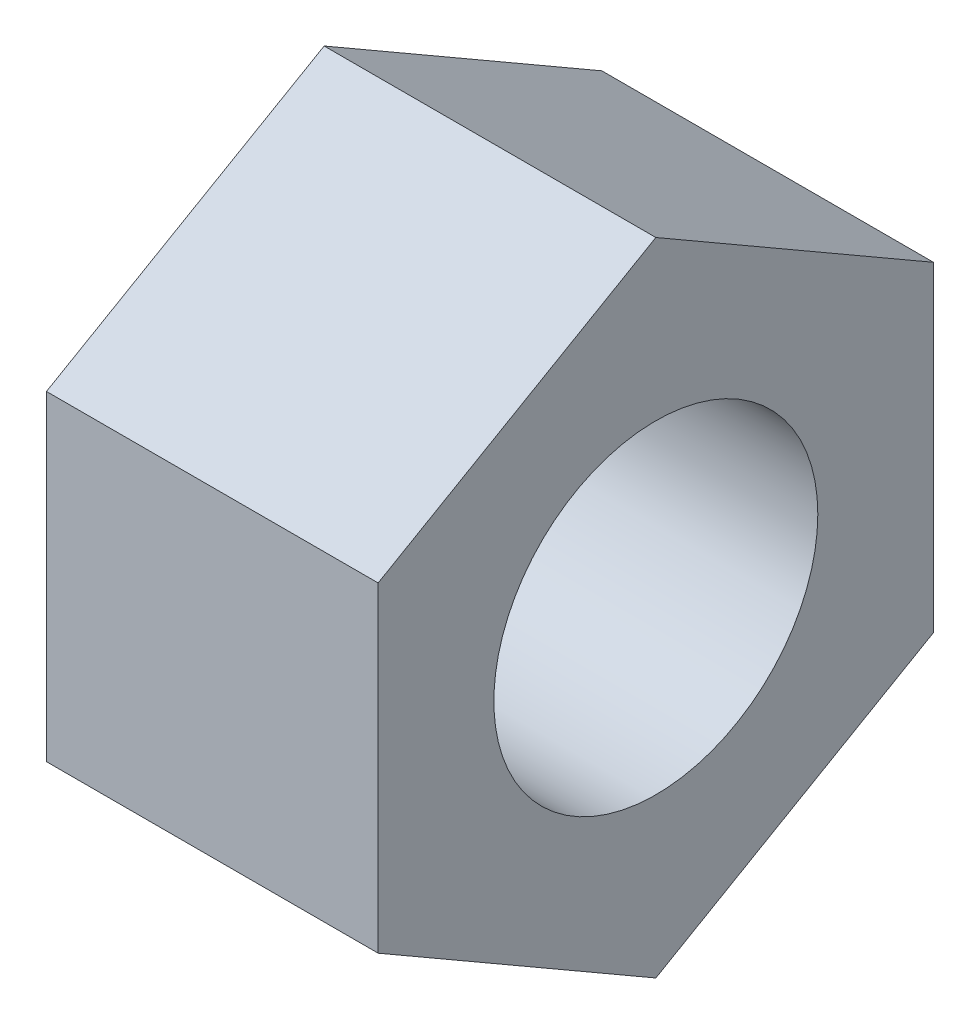
ISO-10303-21;
HEADER;
FILE_DESCRIPTION(('STEP AP214'),'2;1');
FILE_NAME('part.step','',(''),(''),'','','');
FILE_SCHEMA(('AUTOMOTIVE_DESIGN { 1 0 10303 214 1 1 1 1 }'));
ENDSEC;
DATA;
#1=APPLICATION_CONTEXT('core data for automotive mechanical design processes');
#2=APPLICATION_PROTOCOL_DEFINITION('international standard','automotive_design',2000,#1);
#3=PRODUCT_CONTEXT('',#1,'mechanical');
#4=PRODUCT('Part','Part','',(#3));
#5=PRODUCT_RELATED_PRODUCT_CATEGORY('part','',(#4));
#6=PRODUCT_DEFINITION_FORMATION('','',#4);
#7=PRODUCT_DEFINITION_CONTEXT('part definition',#1,'design');
#8=PRODUCT_DEFINITION('design','',#6,#7);
#9=PRODUCT_DEFINITION_SHAPE('','',#8);
#10=(LENGTH_UNIT() NAMED_UNIT(*) SI_UNIT(.MILLI.,.METRE.));
#11=(NAMED_UNIT(*) PLANE_ANGLE_UNIT() SI_UNIT($,.RADIAN.));
#12=(NAMED_UNIT(*) SI_UNIT($,.STERADIAN.) SOLID_ANGLE_UNIT());
#13=UNCERTAINTY_MEASURE_WITH_UNIT(LENGTH_MEASURE(1.E-05),#10,'distance_accuracy_value','');
#14=(GEOMETRIC_REPRESENTATION_CONTEXT(3) GLOBAL_UNCERTAINTY_ASSIGNED_CONTEXT((#13)) GLOBAL_UNIT_ASSIGNED_CONTEXT((#10,
#11,#12)) REPRESENTATION_CONTEXT('',''));
#15=CARTESIAN_POINT('',(0.,0.,0.));
#16=DIRECTION('',(0.,0.,1.));
#17=DIRECTION('',(1.,0.,0.));
#18=AXIS2_PLACEMENT_3D('',#15,#16,#17);
#19=CARTESIAN_POINT('',(21.5,-10.3923048454133,-18.));
#20=DIRECTION('',(1.,0.,0.));
#21=DIRECTION('',(0.,0.,-1.));
#22=AXIS2_PLACEMENT_3D('',#19,#20,#21);
#23=PLANE('',#22);
#24=DIRECTION('',(0.,0.5,-0.866025403784439));
#25=VECTOR('',#24,1.);
#26=CARTESIAN_POINT('',(21.5,-20.7846096908265,0.));
#27=LINE('',#26,#25);
#28=CARTESIAN_POINT('',(21.5,-20.7846096908265,0.));
#29=VERTEX_POINT('',#28);
#30=CARTESIAN_POINT('',(21.5,-10.3923048454133,-18.));
#31=VERTEX_POINT('',#30);
#32=EDGE_CURVE('E132',#29,#31,#27,.T.);
#33=ORIENTED_EDGE('',*,*,#32,.T.);
#34=DIRECTION('',(0.,1.,0.));
#35=VECTOR('',#34,1.);
#36=CARTESIAN_POINT('',(21.5,-10.3923048454133,-18.));
#37=LINE('',#36,#35);
#38=CARTESIAN_POINT('',(21.5,10.3923048454133,-18.));
#39=VERTEX_POINT('',#38);
#40=EDGE_CURVE('E90',#31,#39,#37,.T.);
#41=ORIENTED_EDGE('',*,*,#40,.T.);
#42=DIRECTION('',(0.,0.5,0.866025403784439));
#43=VECTOR('',#42,1.);
#44=CARTESIAN_POINT('',(21.5,10.3923048454133,-18.));
#45=LINE('',#44,#43);
#46=CARTESIAN_POINT('',(21.5,20.7846096908265,0.));
#47=VERTEX_POINT('',#46);
#48=EDGE_CURVE('E103',#39,#47,#45,.T.);
#49=ORIENTED_EDGE('',*,*,#48,.T.);
#50=DIRECTION('',(0.,-0.5,0.866025403784439));
#51=VECTOR('',#50,1.);
#52=CARTESIAN_POINT('',(21.5,20.7846096908265,0.));
#53=LINE('',#52,#51);
#54=CARTESIAN_POINT('',(21.5,10.3923048454133,18.));
#55=VERTEX_POINT('',#54);
#56=EDGE_CURVE('E97',#47,#55,#53,.T.);
#57=ORIENTED_EDGE('',*,*,#56,.T.);
#58=DIRECTION('',(0.,-1.,0.));
#59=VECTOR('',#58,1.);
#60=CARTESIAN_POINT('',(21.5,10.3923048454133,18.));
#61=LINE('',#60,#59);
#62=CARTESIAN_POINT('',(21.5,-10.3923048454133,18.));
#63=VERTEX_POINT('',#62);
#64=EDGE_CURVE('E101',#55,#63,#61,.T.);
#65=ORIENTED_EDGE('',*,*,#64,.T.);
#66=DIRECTION('',(0.,-0.5,-0.866025403784439));
#67=VECTOR('',#66,1.);
#68=CARTESIAN_POINT('',(21.5,-10.3923048454133,18.));
#69=LINE('',#68,#67);
#70=EDGE_CURVE('E53',#63,#29,#69,.T.);
#71=ORIENTED_EDGE('',*,*,#70,.T.);
#72=EDGE_LOOP('',(#33,#41,#49,#57,#65,#71));
#73=FACE_BOUND('',#72,.T.);
#74=CARTESIAN_POINT('',(21.5,0.,0.));
#75=DIRECTION('',(1.,0.,0.));
#76=DIRECTION('',(0.,0.,-1.));
#77=AXIS2_PLACEMENT_3D('',#74,#75,#76);
#78=CIRCLE('',#77,10.5);
#79=CARTESIAN_POINT('',(21.5,0.,-10.5));
#80=VERTEX_POINT('',#79);
#81=EDGE_CURVE('E125',#80,#80,#78,.T.);
#82=ORIENTED_EDGE('',*,*,#81,.F.);
#83=EDGE_LOOP('',(#82));
#84=FACE_BOUND('',#83,.T.);
#85=ADVANCED_FACE('F36',(#73,#84),#23,.T.);
#86=CARTESIAN_POINT('',(0.,-10.3923048454133,-18.));
#87=DIRECTION('',(1.,0.,0.));
#88=DIRECTION('',(0.,0.,-1.));
#89=AXIS2_PLACEMENT_3D('',#86,#87,#88);
#90=PLANE('',#89);
#91=DIRECTION('',(0.,0.5,-0.866025403784439));
#92=VECTOR('',#91,1.);
#93=CARTESIAN_POINT('',(0.,-20.7846096908265,0.));
#94=LINE('',#93,#92);
#95=CARTESIAN_POINT('',(0.,-20.7846096908265,0.));
#96=VERTEX_POINT('',#95);
#97=CARTESIAN_POINT('',(0.,-10.3923048454133,-18.));
#98=VERTEX_POINT('',#97);
#99=EDGE_CURVE('E121',#96,#98,#94,.T.);
#100=ORIENTED_EDGE('',*,*,#99,.F.);
#101=DIRECTION('',(0.,-0.5,-0.866025403784439));
#102=VECTOR('',#101,1.);
#103=CARTESIAN_POINT('',(0.,-10.3923048454133,18.));
#104=LINE('',#103,#102);
#105=CARTESIAN_POINT('',(0.,-10.3923048454133,18.));
#106=VERTEX_POINT('',#105);
#107=EDGE_CURVE('E82',#106,#96,#104,.T.);
#108=ORIENTED_EDGE('',*,*,#107,.F.);
#109=DIRECTION('',(0.,-1.,0.));
#110=VECTOR('',#109,1.);
#111=CARTESIAN_POINT('',(0.,10.3923048454133,18.));
#112=LINE('',#111,#110);
#113=CARTESIAN_POINT('',(0.,10.3923048454133,18.));
#114=VERTEX_POINT('',#113);
#115=EDGE_CURVE('E76',#114,#106,#112,.T.);
#116=ORIENTED_EDGE('',*,*,#115,.F.);
#117=DIRECTION('',(0.,-0.5,0.866025403784439));
#118=VECTOR('',#117,1.);
#119=CARTESIAN_POINT('',(0.,20.7846096908265,0.));
#120=LINE('',#119,#118);
#121=CARTESIAN_POINT('',(0.,20.7846096908265,0.));
#122=VERTEX_POINT('',#121);
#123=EDGE_CURVE('E111',#122,#114,#120,.T.);
#124=ORIENTED_EDGE('',*,*,#123,.F.);
#125=DIRECTION('',(0.,0.5,0.866025403784439));
#126=VECTOR('',#125,1.);
#127=CARTESIAN_POINT('',(0.,10.3923048454133,-18.));
#128=LINE('',#127,#126);
#129=CARTESIAN_POINT('',(0.,10.3923048454133,-18.));
#130=VERTEX_POINT('',#129);
#131=EDGE_CURVE('E127',#130,#122,#128,.T.);
#132=ORIENTED_EDGE('',*,*,#131,.F.);
#133=DIRECTION('',(0.,1.,0.));
#134=VECTOR('',#133,1.);
#135=CARTESIAN_POINT('',(0.,-10.3923048454133,-18.));
#136=LINE('',#135,#134);
#137=EDGE_CURVE('E124',#98,#130,#136,.T.);
#138=ORIENTED_EDGE('',*,*,#137,.F.);
#139=EDGE_LOOP('',(#100,#108,#116,#124,#132,#138));
#140=FACE_BOUND('',#139,.T.);
#141=CARTESIAN_POINT('',(0.,0.,0.));
#142=DIRECTION('',(1.,0.,0.));
#143=DIRECTION('',(0.,0.,-1.));
#144=AXIS2_PLACEMENT_3D('',#141,#142,#143);
#145=CIRCLE('',#144,10.5);
#146=CARTESIAN_POINT('',(0.,0.,-10.5));
#147=VERTEX_POINT('',#146);
#148=EDGE_CURVE('E227',#147,#147,#145,.T.);
#149=ORIENTED_EDGE('',*,*,#148,.T.);
#150=EDGE_LOOP('',(#149));
#151=FACE_BOUND('',#150,.T.);
#152=ADVANCED_FACE('F141',(#140,#151),#90,.F.);
#153=CARTESIAN_POINT('',(21.5,-20.7846096908265,0.));
#154=DIRECTION('',(0.,0.866025403784439,0.5));
#155=DIRECTION('',(0.,-0.5,0.866025403784439));
#156=AXIS2_PLACEMENT_3D('',#153,#154,#155);
#157=PLANE('',#156);
#158=ORIENTED_EDGE('',*,*,#99,.T.);
#159=DIRECTION('',(-1.,0.,0.));
#160=VECTOR('',#159,1.);
#161=CARTESIAN_POINT('',(21.5,-10.3923048454133,-18.));
#162=LINE('',#161,#160);
#163=EDGE_CURVE('E11',#31,#98,#162,.T.);
#164=ORIENTED_EDGE('',*,*,#163,.F.);
#165=ORIENTED_EDGE('',*,*,#32,.F.);
#166=DIRECTION('',(-1.,0.,0.));
#167=VECTOR('',#166,1.);
#168=CARTESIAN_POINT('',(21.5,-20.7846096908265,0.));
#169=LINE('',#168,#167);
#170=EDGE_CURVE('E117',#29,#96,#169,.T.);
#171=ORIENTED_EDGE('',*,*,#170,.T.);
#172=EDGE_LOOP('',(#158,#164,#165,#171));
#173=FACE_BOUND('',#172,.T.);
#174=ADVANCED_FACE('F38',(#173),#157,.F.);
#175=CARTESIAN_POINT('',(21.5,-10.3923048454133,-18.));
#176=DIRECTION('',(0.,0.,1.));
#177=DIRECTION('',(0.,-1.,0.));
#178=AXIS2_PLACEMENT_3D('',#175,#176,#177);
#179=PLANE('',#178);
#180=ORIENTED_EDGE('',*,*,#137,.T.);
#181=DIRECTION('',(-1.,0.,0.));
#182=VECTOR('',#181,1.);
#183=CARTESIAN_POINT('',(21.5,10.3923048454133,-18.));
#184=LINE('',#183,#182);
#185=EDGE_CURVE('E45',#39,#130,#184,.T.);
#186=ORIENTED_EDGE('',*,*,#185,.F.);
#187=ORIENTED_EDGE('',*,*,#40,.F.);
#188=ORIENTED_EDGE('',*,*,#163,.T.);
#189=EDGE_LOOP('',(#180,#186,#187,#188));
#190=FACE_BOUND('',#189,.T.);
#191=ADVANCED_FACE('F166',(#190),#179,.F.);
#192=CARTESIAN_POINT('',(21.5,10.3923048454133,-18.));
#193=DIRECTION('',(0.,-0.866025403784439,0.5));
#194=DIRECTION('',(0.,-0.5,-0.866025403784439));
#195=AXIS2_PLACEMENT_3D('',#192,#193,#194);
#196=PLANE('',#195);
#197=ORIENTED_EDGE('',*,*,#131,.T.);
#198=DIRECTION('',(-1.,0.,0.));
#199=VECTOR('',#198,1.);
#200=CARTESIAN_POINT('',(21.5,20.7846096908265,0.));
#201=LINE('',#200,#199);
#202=EDGE_CURVE('E112',#47,#122,#201,.T.);
#203=ORIENTED_EDGE('',*,*,#202,.F.);
#204=ORIENTED_EDGE('',*,*,#48,.F.);
#205=ORIENTED_EDGE('',*,*,#185,.T.);
#206=EDGE_LOOP('',(#197,#203,#204,#205));
#207=FACE_BOUND('',#206,.T.);
#208=ADVANCED_FACE('F138',(#207),#196,.F.);
#209=CARTESIAN_POINT('',(21.5,20.7846096908265,0.));
#210=DIRECTION('',(0.,-0.866025403784439,-0.5));
#211=DIRECTION('',(0.,0.5,-0.866025403784439));
#212=AXIS2_PLACEMENT_3D('',#209,#210,#211);
#213=PLANE('',#212);
#214=ORIENTED_EDGE('',*,*,#123,.T.);
#215=DIRECTION('',(-1.,0.,0.));
#216=VECTOR('',#215,1.);
#217=CARTESIAN_POINT('',(21.5,10.3923048454133,18.));
#218=LINE('',#217,#216);
#219=EDGE_CURVE('E108',#55,#114,#218,.T.);
#220=ORIENTED_EDGE('',*,*,#219,.F.);
#221=ORIENTED_EDGE('',*,*,#56,.F.);
#222=ORIENTED_EDGE('',*,*,#202,.T.);
#223=EDGE_LOOP('',(#214,#220,#221,#222));
#224=FACE_BOUND('',#223,.T.);
#225=ADVANCED_FACE('F109',(#224),#213,.F.);
#226=CARTESIAN_POINT('',(21.5,10.3923048454133,18.));
#227=DIRECTION('',(0.,0.,-1.));
#228=DIRECTION('',(0.,1.,0.));
#229=AXIS2_PLACEMENT_3D('',#226,#227,#228);
#230=PLANE('',#229);
#231=ORIENTED_EDGE('',*,*,#115,.T.);
#232=DIRECTION('',(-1.,0.,0.));
#233=VECTOR('',#232,1.);
#234=CARTESIAN_POINT('',(21.5,-10.3923048454133,18.));
#235=LINE('',#234,#233);
#236=EDGE_CURVE('E113',#63,#106,#235,.T.);
#237=ORIENTED_EDGE('',*,*,#236,.F.);
#238=ORIENTED_EDGE('',*,*,#64,.F.);
#239=ORIENTED_EDGE('',*,*,#219,.T.);
#240=EDGE_LOOP('',(#231,#237,#238,#239));
#241=FACE_BOUND('',#240,.T.);
#242=ADVANCED_FACE('F115',(#241),#230,.F.);
#243=CARTESIAN_POINT('',(21.5,-10.3923048454133,18.));
#244=DIRECTION('',(0.,0.866025403784439,-0.5));
#245=DIRECTION('',(0.,0.5,0.866025403784439));
#246=AXIS2_PLACEMENT_3D('',#243,#244,#245);
#247=PLANE('',#246);
#248=ORIENTED_EDGE('',*,*,#107,.T.);
#249=ORIENTED_EDGE('',*,*,#170,.F.);
#250=ORIENTED_EDGE('',*,*,#70,.F.);
#251=ORIENTED_EDGE('',*,*,#236,.T.);
#252=EDGE_LOOP('',(#248,#249,#250,#251));
#253=FACE_BOUND('',#252,.T.);
#254=ADVANCED_FACE('F146',(#253),#247,.F.);
#255=CARTESIAN_POINT('',(21.5,0.,0.));
#256=DIRECTION('',(-1.,0.,0.));
#257=DIRECTION('',(0.,0.,1.));
#258=AXIS2_PLACEMENT_3D('',#255,#256,#257);
#259=CYLINDRICAL_SURFACE('',#258,10.5);
#260=ORIENTED_EDGE('',*,*,#81,.T.);
#261=EDGE_LOOP('',(#260));
#262=FACE_BOUND('',#261,.T.);
#263=ORIENTED_EDGE('',*,*,#148,.F.);
#264=EDGE_LOOP('',(#263));
#265=FACE_BOUND('',#264,.T.);
#266=ADVANCED_FACE('F148',(#262,#265),#259,.F.);
#267=CLOSED_SHELL('',(#85,#152,#174,#191,#208,#225,#242,#254,#266));
#268=MANIFOLD_SOLID_BREP('B2',#267);
#269=ADVANCED_BREP_SHAPE_REPRESENTATION('',(#18,#268),#14);
#270=SHAPE_DEFINITION_REPRESENTATION(#9,#269);
ENDSEC;
END-ISO-10303-21;
